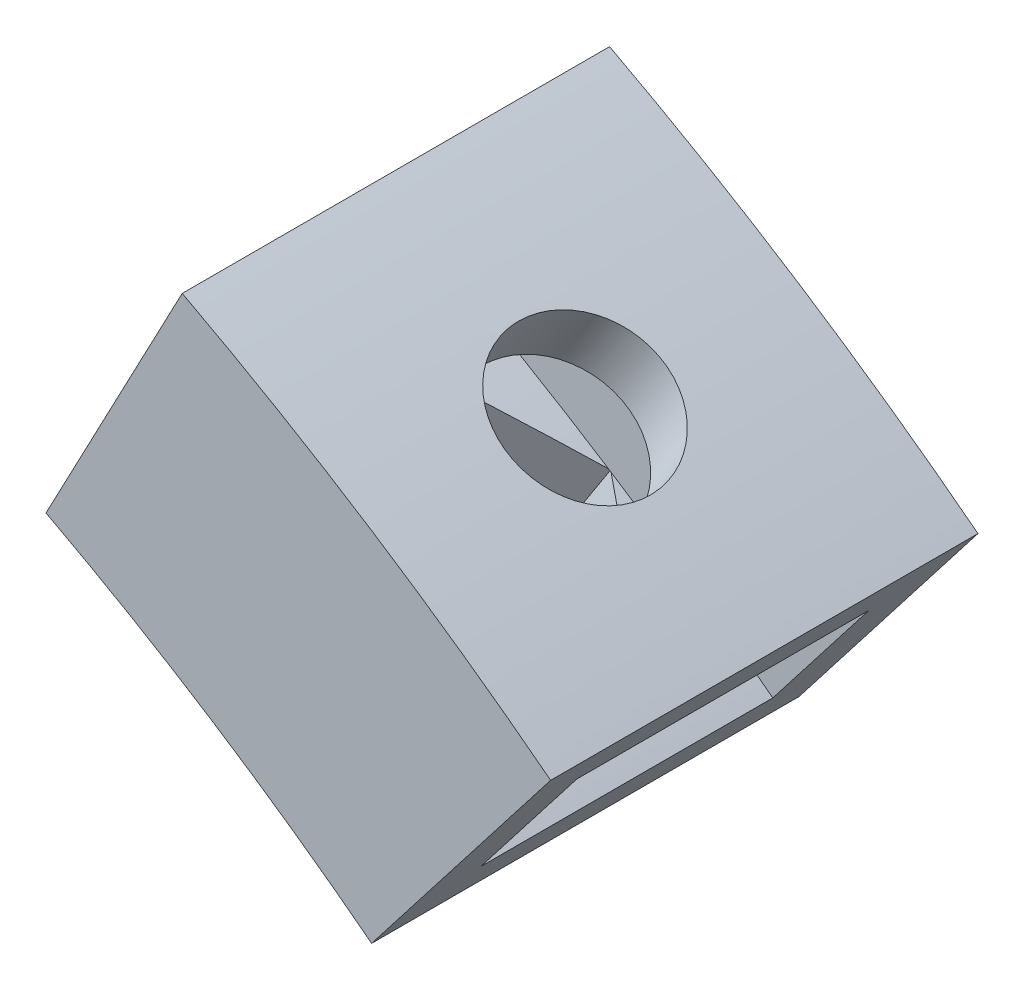
ISO-10303-21;
HEADER;
FILE_DESCRIPTION(('STEP AP214'),'2;1');
FILE_NAME('part.step','',(''),(''),'','','');
FILE_SCHEMA(('AUTOMOTIVE_DESIGN { 1 0 10303 214 1 1 1 1 }'));
ENDSEC;
DATA;
#1=APPLICATION_CONTEXT('core data for automotive mechanical design processes');
#2=APPLICATION_PROTOCOL_DEFINITION('international standard','automotive_design',2000,#1);
#3=PRODUCT_CONTEXT('',#1,'mechanical');
#4=PRODUCT('Part','Part','',(#3));
#5=PRODUCT_RELATED_PRODUCT_CATEGORY('part','',(#4));
#6=PRODUCT_DEFINITION_FORMATION('','',#4);
#7=PRODUCT_DEFINITION_CONTEXT('part definition',#1,'design');
#8=PRODUCT_DEFINITION('design','',#6,#7);
#9=PRODUCT_DEFINITION_SHAPE('','',#8);
#10=(LENGTH_UNIT() NAMED_UNIT(*) SI_UNIT(.MILLI.,.METRE.));
#11=(NAMED_UNIT(*) PLANE_ANGLE_UNIT() SI_UNIT($,.RADIAN.));
#12=(NAMED_UNIT(*) SI_UNIT($,.STERADIAN.) SOLID_ANGLE_UNIT());
#13=UNCERTAINTY_MEASURE_WITH_UNIT(LENGTH_MEASURE(1.E-05),#10,'distance_accuracy_value','');
#14=(GEOMETRIC_REPRESENTATION_CONTEXT(3) GLOBAL_UNCERTAINTY_ASSIGNED_CONTEXT((#13)) GLOBAL_UNIT_ASSIGNED_CONTEXT((#10,
#11,#12)) REPRESENTATION_CONTEXT('',''));
#15=CARTESIAN_POINT('',(0.,0.,0.));
#16=DIRECTION('',(0.,0.,1.));
#17=DIRECTION('',(1.,0.,0.));
#18=AXIS2_PLACEMENT_3D('',#15,#16,#17);
#19=CARTESIAN_POINT('',(2.00000000000008,25.,6.35));
#20=DIRECTION('',(0.,0.,1.));
#21=DIRECTION('',(1.,0.,0.));
#22=AXIS2_PLACEMENT_3D('',#19,#20,#21);
#23=CYLINDRICAL_SURFACE('',#22,107.45);
#24=CARTESIAN_POINT('',(2.00000000000008,25.,6.8924075135857));
#25=DIRECTION('',(-0.420243080128222,0.270916506703347,0.866025403784438));
#26=DIRECTION('',(0.727882366311319,-0.469241154219272,0.5));
#27=AXIS2_PLACEMENT_3D('',#24,#25,#26);
#28=ELLIPSE('',#27,124.072572848851,107.45);
#29=CARTESIAN_POINT('',(55.1131937531535,118.404984606497,3.44620375679288));
#30=VERTEX_POINT('',#29);
#31=CARTESIAN_POINT('',(60.1582151263532,115.350026070348,6.85));
#32=VERTEX_POINT('',#31);
#33=EDGE_CURVE('E207',#30,#32,#28,.F.);
#34=ORIENTED_EDGE('',*,*,#33,.F.);
#35=DIRECTION('',(0.,0.,1.));
#36=VECTOR('',#35,1.);
#37=CARTESIAN_POINT('',(55.1131937531535,118.404984606497,6.35));
#38=LINE('',#37,#36);
#39=CARTESIAN_POINT('',(55.1131937531534,118.404984606497,-3.44620375679288));
#40=VERTEX_POINT('',#39);
#41=EDGE_CURVE('E415',#40,#30,#38,.T.);
#42=ORIENTED_EDGE('',*,*,#41,.F.);
#43=CARTESIAN_POINT('',(2.00000000000008,25.,-6.89240751358571));
#44=DIRECTION('',(-0.420243080128222,0.270916506703348,-0.866025403784438));
#45=DIRECTION('',(-0.727882366311319,0.469241154219272,0.500000000000001));
#46=AXIS2_PLACEMENT_3D('',#43,#44,#45);
#47=ELLIPSE('',#46,124.072572848851,107.45);
#48=CARTESIAN_POINT('',(60.1582151263532,115.350026070348,-6.85));
#49=VERTEX_POINT('',#48);
#50=EDGE_CURVE('E187',#49,#40,#47,.F.);
#51=ORIENTED_EDGE('',*,*,#50,.F.);
#52=CARTESIAN_POINT('',(2.00000000000008,25.,-6.85));
#53=DIRECTION('',(0.,0.,1.));
#54=DIRECTION('',(1.,0.,0.));
#55=AXIS2_PLACEMENT_3D('',#52,#53,#54);
#56=CIRCLE('',#55,107.45);
#57=CARTESIAN_POINT('',(52.1273569123766,120.040783819259,-6.85));
#58=VERTEX_POINT('',#57);
#59=EDGE_CURVE('E290',#49,#58,#56,.T.);
#60=ORIENTED_EDGE('',*,*,#59,.T.);
#61=DIRECTION('',(0.,0.,-1.));
#62=VECTOR('',#61,1.);
#63=CARTESIAN_POINT('',(52.1273569123766,120.040783819259,6.85));
#64=LINE('',#63,#62);
#65=CARTESIAN_POINT('',(52.1273569123766,120.040783819259,6.85));
#66=VERTEX_POINT('',#65);
#67=EDGE_CURVE('E375',#66,#58,#64,.T.);
#68=ORIENTED_EDGE('',*,*,#67,.F.);
#69=CARTESIAN_POINT('',(2.00000000000008,25.,6.85));
#70=DIRECTION('',(0.,0.,1.));
#71=DIRECTION('',(1.,0.,0.));
#72=AXIS2_PLACEMENT_3D('',#69,#70,#71);
#73=CIRCLE('',#72,107.45);
#74=EDGE_CURVE('E298',#32,#66,#73,.T.);
#75=ORIENTED_EDGE('',*,*,#74,.F.);
#76=EDGE_LOOP('',(#34,#42,#51,#60,#68,#75));
#77=FACE_BOUND('',#76,.T.);
#78=ADVANCED_FACE('F43',(#77),#23,.T.);
#79=CARTESIAN_POINT('',(65.9231162623651,107.383923385016,-10.025));
#80=DIRECTION('',(0.,0.,1.));
#81=DIRECTION('',(1.,0.,0.));
#82=AXIS2_PLACEMENT_3D('',#79,#80,#81);
#83=PLANE('',#82);
#84=CARTESIAN_POINT('',(2.00000000000008,25.,-10.025));
#85=DIRECTION('',(0.,0.,1.));
#86=DIRECTION('',(1.,0.,0.));
#87=AXIS2_PLACEMENT_3D('',#84,#85,#86);
#88=CIRCLE('',#87,117.975);
#89=CARTESIAN_POINT('',(74.3215501419566,118.20780015677,-10.025));
#90=VERTEX_POINT('',#89);
#91=CARTESIAN_POINT('',(57.0374586480934,129.350269623798,-10.025));
#92=VERTEX_POINT('',#91);
#93=EDGE_CURVE('E322',#90,#92,#88,.T.);
#94=ORIENTED_EDGE('',*,*,#93,.F.);
#95=DIRECTION('',(0.6130243707731,0.790063997938296,0.));
#96=VECTOR('',#95,1.);
#97=CARTESIAN_POINT('',(65.9231162623651,107.383923385016,-10.025));
#98=LINE('',#97,#96);
#99=CARTESIAN_POINT('',(65.9231162623651,107.383923385016,-10.025));
#100=VERTEX_POINT('',#99);
#101=EDGE_CURVE('E332',#100,#90,#98,.T.);
#102=ORIENTED_EDGE('',*,*,#101,.F.);
#103=CARTESIAN_POINT('',(2.00000000000008,25.,-10.025));
#104=DIRECTION('',(0.,0.,1.));
#105=DIRECTION('',(1.,0.,0.));
#106=AXIS2_PLACEMENT_3D('',#103,#104,#105);
#107=CIRCLE('',#106,104.275);
#108=CARTESIAN_POINT('',(50.6461623270179,117.232459122878,-10.025));
#109=VERTEX_POINT('',#108);
#110=EDGE_CURVE('E69',#100,#109,#107,.T.);
#111=ORIENTED_EDGE('',*,*,#110,.T.);
#112=DIRECTION('',(0.466517979640545,0.884511715395621,0.));
#113=VECTOR('',#112,1.);
#114=CARTESIAN_POINT('',(50.6461623270179,117.232459122878,-10.025));
#115=LINE('',#114,#113);
#116=EDGE_CURVE('E329',#109,#92,#115,.T.);
#117=ORIENTED_EDGE('',*,*,#116,.T.);
#118=EDGE_LOOP('',(#94,#102,#111,#117));
#119=FACE_BOUND('',#118,.T.);
#120=ADVANCED_FACE('F261',(#119),#83,.F.);
#121=CARTESIAN_POINT('',(2.00000000000008,25.,6.35));
#122=DIRECTION('',(0.,0.,1.));
#123=DIRECTION('',(1.,0.,0.));
#124=AXIS2_PLACEMENT_3D('',#121,#122,#123);
#125=CYLINDRICAL_SURFACE('',#124,117.975);
#126=CARTESIAN_POINT('',(62.8029414199607,126.099470521268,0.));
#127=CARTESIAN_POINT('',(62.8029495165777,126.099466220601,-0.206372626392673));
#128=CARTESIAN_POINT('',(62.8178977873018,126.090480174403,-0.412893617834125));
#129=CARTESIAN_POINT('',(62.8772958156336,126.054720991092,-0.8202442186931));
#130=CARTESIAN_POINT('',(62.921780791923,126.027926619828,-1.02106673498274));
#131=CARTESIAN_POINT('',(63.0389090161015,125.957203133765,-1.4110601853181));
#132=CARTESIAN_POINT('',(63.1115384632237,125.91328241688,-1.60023677738864));
#133=CARTESIAN_POINT('',(63.282762764463,125.809392379523,-1.96160960106666));
#134=CARTESIAN_POINT('',(63.3813512893251,125.749426970957,-2.13380995771587));
#135=CARTESIAN_POINT('',(63.6016126375272,125.614902252788,-2.45647785291352));
#136=CARTESIAN_POINT('',(63.7232948580627,125.540337001882,-2.6069365003585));
#137=CARTESIAN_POINT('',(63.9861235302592,125.378508062639,-2.8817751217911));
#138=CARTESIAN_POINT('',(64.1272707575135,125.291243868298,-3.00615405612077));
#139=CARTESIAN_POINT('',(64.4249086000639,125.106253913639,-3.2253174131053));
#140=CARTESIAN_POINT('',(64.5814020444935,125.008526224029,-3.32009636536239));
#141=CARTESIAN_POINT('',(64.9051478286196,124.805207790806,-3.47733377303638));
#142=CARTESIAN_POINT('',(65.0724001235013,124.699617079945,-3.53979236307031));
#143=CARTESIAN_POINT('',(65.4127724237043,124.483473632401,-3.63059658463169));
#144=CARTESIAN_POINT('',(65.5858904926997,124.37292252934,-3.65895336271014));
#145=CARTESIAN_POINT('',(65.9330881558451,124.149903826806,-3.68078335865567));
#146=CARTESIAN_POINT('',(66.1071677459921,124.037436235308,-3.67425672163718));
#147=CARTESIAN_POINT('',(66.4512930378886,123.81383280504,-3.62651455667658));
#148=CARTESIAN_POINT('',(66.6213401177839,123.702696517903,-3.58531106077814));
#149=CARTESIAN_POINT('',(66.9526961438451,123.484959350499,-3.46940340935781));
#150=CARTESIAN_POINT('',(67.1140050700372,123.378358480598,-3.3946991772632));
#151=CARTESIAN_POINT('',(67.4234382270066,123.172852142706,-3.21389683984375));
#152=CARTESIAN_POINT('',(67.5715601368659,123.073948029729,-3.10779322237277));
#153=CARTESIAN_POINT('',(67.8505209774469,122.886862071692,-2.8672081078721));
#154=CARTESIAN_POINT('',(67.9813598650361,122.798680253391,-2.73272654002294));
#155=CARTESIAN_POINT('',(68.2222459223635,122.635731038115,-2.43913486189143));
#156=CARTESIAN_POINT('',(68.3322842338592,122.560969356991,-2.28001431096266));
#157=CARTESIAN_POINT('',(68.5285249622798,122.427255620289,-1.94169834637941));
#158=CARTESIAN_POINT('',(68.6147273752004,122.368303567368,-1.76250292935245));
#159=CARTESIAN_POINT('',(68.7609783006208,122.268084694122,-1.38911801062646));
#160=CARTESIAN_POINT('',(68.8210265280352,122.226818066573,-1.19492834551445));
#161=CARTESIAN_POINT('',(68.9133571759096,122.163297719665,-0.797069987249016));
#162=CARTESIAN_POINT('',(68.9456396779101,122.141043944472,-0.593401321934711));
#163=CARTESIAN_POINT('',(68.9815673016802,122.116274400647,-0.182458120883018));
#164=CARTESIAN_POINT('',(68.9852244553971,122.113750339127,0.0248148631490834));
#165=CARTESIAN_POINT('',(68.9638353190534,122.128500177096,0.437163506354018));
#166=CARTESIAN_POINT('',(68.9387890649607,122.145774051777,0.642239168279964));
#167=CARTESIAN_POINT('',(68.8606707292865,122.19955534612,1.04433102243375));
#168=CARTESIAN_POINT('',(68.8076041244301,122.236059007215,1.2413487815159));
#169=CARTESIAN_POINT('',(68.6748689408076,122.32712323558,1.62178030440115));
#170=CARTESIAN_POINT('',(68.5952003040792,122.381683842194,1.8051940385618));
#171=CARTESIAN_POINT('',(68.4113685829763,122.507143782334,2.15327831960398));
#172=CARTESIAN_POINT('',(68.3071973149612,122.578048574501,2.31794257701402));
#173=CARTESIAN_POINT('',(68.0771852130066,122.733952497434,2.62379049924137));
#174=CARTESIAN_POINT('',(67.9513443201075,122.81895166655,2.76497410016949));
#175=CARTESIAN_POINT('',(67.6813644755462,123.000435716536,3.01990176385725));
#176=CARTESIAN_POINT('',(67.5372192679838,123.096924523537,3.13363640660482));
#177=CARTESIAN_POINT('',(67.234616675129,123.298415095514,3.33037322583278));
#178=CARTESIAN_POINT('',(67.0761593234088,123.403416840523,3.41337547440015));
#179=CARTESIAN_POINT('',(66.74935061902,123.618763302225,3.5462748590417));
#180=CARTESIAN_POINT('',(66.5810010956068,123.729107030422,3.59617809492772));
#181=CARTESIAN_POINT('',(66.2390928498153,123.951913545389,3.6614828885046));
#182=CARTESIAN_POINT('',(66.0655341330894,124.064376329861,3.67688448363088));
#183=CARTESIAN_POINT('',(65.7181912414749,124.288143264432,3.67274810044119));
#184=CARTESIAN_POINT('',(65.5444071936622,124.399447886373,3.65322495996852));
#185=CARTESIAN_POINT('',(65.2015011708493,124.617830792783,3.57982382024783));
#186=CARTESIAN_POINT('',(65.0323792050633,124.724909068899,3.52594575310522));
#187=CARTESIAN_POINT('',(64.7036683028243,124.931918655813,3.38536629617609));
#188=CARTESIAN_POINT('',(64.544079523212,125.031849849033,3.29866436654115));
#189=CARTESIAN_POINT('',(64.2390807130739,125.221902728704,3.09490317954418));
#190=CARTESIAN_POINT('',(64.0936701734583,125.312024767381,2.97784501271845));
#191=CARTESIAN_POINT('',(63.821235873021,125.480152768315,2.71664951455218));
#192=CARTESIAN_POINT('',(63.6942179778653,125.558154865933,2.57250357807923));
#193=CARTESIAN_POINT('',(63.4623443292489,125.700046608506,2.26119757377545));
#194=CARTESIAN_POINT('',(63.3574940697148,125.763932755203,2.09403181772834));
#195=CARTESIAN_POINT('',(63.1730549757024,125.876011330005,1.74136308475961));
#196=CARTESIAN_POINT('',(63.0934829095249,125.924193341313,1.55584804236542));
#197=CARTESIAN_POINT('',(62.9621498437435,126.003578432197,1.1719744889172));
#198=CARTESIAN_POINT('',(62.9103556941987,126.034801750709,0.97363160484585));
#199=CARTESIAN_POINT('',(62.849854004998,126.071245066963,0.645030597501));
#200=CARTESIAN_POINT('',(62.832284999726,126.081817936066,0.516905171198313));
#201=CARTESIAN_POINT('',(62.8088261661371,126.095932012823,0.259206009667065));
#202=CARTESIAN_POINT('',(62.8029363340979,126.099473222718,0.129632274900126));
#203=CARTESIAN_POINT('',(62.8029414199607,126.099470521268,0.));
#204=B_SPLINE_CURVE_WITH_KNOTS('',3,(#126,#127,#128,#129,#130,#131,#132,#133,#134,#135,#136,
#137,#138,#139,#140,#141,#142,#143,#144,#145,#146,#147,#148,#149,#150,#151,#152,#153,#154,#155,
#156,#157,#158,#159,#160,#161,#162,#163,#164,#165,#166,#167,#168,#169,#170,#171,#172,#173,#174,
#175,#176,#177,#178,#179,#180,#181,#182,#183,#184,#185,#186,#187,#188,#189,#190,#191,#192,#193,
#194,#195,#196,#197,#198,#199,#200,#201,#202,#203),.UNSPECIFIED.,.T.,.F.,(4,2,2,2,2,2,2,2,2,2,2,
2,2,2,2,2,2,2,2,2,2,2,2,2,2,2,2,2,2,2,2,2,2,2,2,2,2,2,4),(0.,0.618644702899641,1.23802838706505,
1.85710873722485,2.47603828484282,3.09522022692702,3.71442684777563,4.33374783709818,
4.95306624687601,5.57218217057634,6.19129551876682,6.8101941379024,7.42909417166343,
8.04810291752728,8.66711320819612,9.28638652285301,9.90565994154492,10.5249401102657,
11.1442184603222,11.7632364982658,12.3822537605264,13.0011500773685,13.6200477427139,
14.2391524081081,14.8582587580145,15.4775772734475,16.0968943361764,16.7160972333258,
17.3352994586195,17.9542386770922,18.573179118759,19.1921297404747,19.8110581297039,
20.430183470989,21.0494620740938,21.6691506222592,22.288097984189,22.6766977086489,
23.0652973092529),.UNSPECIFIED.);
#205=CARTESIAN_POINT('',(62.8029414199607,126.099470521268,0.));
#206=VERTEX_POINT('',#205);
#207=EDGE_CURVE('E221',#206,#206,#204,.T.);
#208=ORIENTED_EDGE('',*,*,#207,.T.);
#209=EDGE_LOOP('',(#208));
#210=FACE_BOUND('',#209,.T.);
#211=CARTESIAN_POINT('',(2.00000000000008,25.,10.025));
#212=DIRECTION('',(0.,0.,1.));
#213=DIRECTION('',(1.,0.,0.));
#214=AXIS2_PLACEMENT_3D('',#211,#212,#213);
#215=CIRCLE('',#214,117.975);
#216=CARTESIAN_POINT('',(74.3215501419566,118.20780015677,10.025));
#217=VERTEX_POINT('',#216);
#218=CARTESIAN_POINT('',(57.0374586480934,129.350269623798,10.025));
#219=VERTEX_POINT('',#218);
#220=EDGE_CURVE('E324',#217,#219,#215,.T.);
#221=ORIENTED_EDGE('',*,*,#220,.F.);
#222=DIRECTION('',(0.,0.,1.));
#223=VECTOR('',#222,1.);
#224=CARTESIAN_POINT('',(74.3215501419566,118.20780015677,-10.025));
#225=LINE('',#224,#223);
#226=EDGE_CURVE('E358',#90,#217,#225,.T.);
#227=ORIENTED_EDGE('',*,*,#226,.F.);
#228=ORIENTED_EDGE('',*,*,#93,.T.);
#229=DIRECTION('',(0.,0.,1.));
#230=VECTOR('',#229,1.);
#231=CARTESIAN_POINT('',(57.0374586480934,129.350269623798,-10.025));
#232=LINE('',#231,#230);
#233=EDGE_CURVE('E339',#92,#219,#232,.T.);
#234=ORIENTED_EDGE('',*,*,#233,.T.);
#235=EDGE_LOOP('',(#221,#227,#228,#234));
#236=FACE_BOUND('',#235,.T.);
#237=ADVANCED_FACE('F45',(#210,#236),#125,.T.);
#238=CARTESIAN_POINT('',(74.3215501419566,118.20780015677,10.025));
#239=DIRECTION('',(0.,0.,-1.));
#240=DIRECTION('',(-1.,0.,0.));
#241=AXIS2_PLACEMENT_3D('',#238,#239,#240);
#242=PLANE('',#241);
#243=CARTESIAN_POINT('',(2.00000000000008,25.,10.025));
#244=DIRECTION('',(0.,0.,1.));
#245=DIRECTION('',(1.,0.,0.));
#246=AXIS2_PLACEMENT_3D('',#243,#244,#245);
#247=CIRCLE('',#246,104.275);
#248=CARTESIAN_POINT('',(65.9231162623651,107.383923385016,10.025));
#249=VERTEX_POINT('',#248);
#250=CARTESIAN_POINT('',(50.6461623270179,117.232459122878,10.025));
#251=VERTEX_POINT('',#250);
#252=EDGE_CURVE('E326',#249,#251,#247,.T.);
#253=ORIENTED_EDGE('',*,*,#252,.F.);
#254=DIRECTION('',(-0.6130243707731,-0.790063997938296,0.));
#255=VECTOR('',#254,1.);
#256=CARTESIAN_POINT('',(74.3215501419566,118.20780015677,10.025));
#257=LINE('',#256,#255);
#258=EDGE_CURVE('E361',#217,#249,#257,.T.);
#259=ORIENTED_EDGE('',*,*,#258,.F.);
#260=ORIENTED_EDGE('',*,*,#220,.T.);
#261=DIRECTION('',(-0.466517979640545,-0.884511715395621,0.));
#262=VECTOR('',#261,1.);
#263=CARTESIAN_POINT('',(57.0374586480934,129.350269623798,10.025));
#264=LINE('',#263,#262);
#265=EDGE_CURVE('E344',#219,#251,#264,.T.);
#266=ORIENTED_EDGE('',*,*,#265,.T.);
#267=EDGE_LOOP('',(#253,#259,#260,#266));
#268=FACE_BOUND('',#267,.T.);
#269=ADVANCED_FACE('F387',(#268),#242,.F.);
#270=CARTESIAN_POINT('',(2.00000000000008,25.,6.35));
#271=DIRECTION('',(0.,0.,1.));
#272=DIRECTION('',(1.,0.,0.));
#273=AXIS2_PLACEMENT_3D('',#270,#271,#272);
#274=CYLINDRICAL_SURFACE('',#273,114.8);
#275=CARTESIAN_POINT('',(61.0817632076541,123.429595428787,0.));
#276=CARTESIAN_POINT('',(61.0817713148924,123.429591146562,-0.206369612489661));
#277=CARTESIAN_POINT('',(61.0967273531652,123.420618085308,-0.412887516359059));
#278=CARTESIAN_POINT('',(61.1561554845957,123.38490953232,-0.82023182033175));
#279=CARTESIAN_POINT('',(61.2006627975054,123.358152845696,-1.02105113059003));
#280=CARTESIAN_POINT('',(61.3178473840906,123.287525327917,-1.41103815244768));
#281=CARTESIAN_POINT('',(61.390510831568,123.243662896549,-1.60021153007944));
#282=CARTESIAN_POINT('',(61.5618106949293,123.139903634579,-1.96157856209948));
#283=CARTESIAN_POINT('',(61.6604407868485,123.080010708014,-2.13377633674206));
#284=CARTESIAN_POINT('',(61.8807898515283,122.945636025833,-2.45644297432695));
#285=CARTESIAN_POINT('',(62.0025186145337,122.871148083761,-2.60690257586155));
#286=CARTESIAN_POINT('',(62.2654386236877,122.709470745875,-2.8817437973276));
#287=CARTESIAN_POINT('',(62.4066306460128,122.622280843512,-3.00612437675323));
#288=CARTESIAN_POINT('',(62.7043531134555,122.437426971292,-3.2252930184621));
#289=CARTESIAN_POINT('',(62.8608865612583,122.339760950654,-3.32007527238429));
#290=CARTESIAN_POINT('',(63.1847016081739,122.136547139525,-3.47731903162065));
#291=CARTESIAN_POINT('',(63.3519831612168,122.030999382817,-3.5397806754607));
#292=CARTESIAN_POINT('',(63.6923967540001,121.814920283551,-3.63058955199574));
#293=CARTESIAN_POINT('',(63.8655267531577,121.704390674803,-3.65894855960196));
#294=CARTESIAN_POINT('',(64.2127323662039,121.481389376185,-3.68078343903503));
#295=CARTESIAN_POINT('',(64.3868079760307,121.368917694654,-3.67425946058336));
#296=CARTESIAN_POINT('',(64.730906205102,121.145283334998,-3.62652347947247));
#297=CARTESIAN_POINT('',(64.9009302856056,121.034120192474,-3.58532418396026));
#298=CARTESIAN_POINT('',(65.2322270956651,120.816307508474,-3.46942672764405));
#299=CARTESIAN_POINT('',(65.3934998046173,120.709657977624,-3.39472848797643));
#300=CARTESIAN_POINT('',(65.702852907937,120.50403694819,-3.21393898649646));
#301=CARTESIAN_POINT('',(65.8509308497502,120.405066877452,-3.10784190424996));
#302=CARTESIAN_POINT('',(66.1297996238151,120.217840002793,-2.86727074818832));
#303=CARTESIAN_POINT('',(66.2605904101135,120.129583227349,-2.73279659894273));
#304=CARTESIAN_POINT('',(66.5013847956901,119.966481279917,-2.43921661812039));
#305=CARTESIAN_POINT('',(66.6113790407794,119.8916421439,-2.28009976062452));
#306=CARTESIAN_POINT('',(66.8075377291119,119.757781747003,-1.94178999395058));
#307=CARTESIAN_POINT('',(66.8937021682884,119.698760488822,-1.76259708134648));
#308=CARTESIAN_POINT('',(67.0398878781649,119.598419040195,-1.38921555810248));
#309=CARTESIAN_POINT('',(67.0999088462696,119.55709905463,-1.1950267739249));
#310=CARTESIAN_POINT('',(67.1921988959453,119.493493803875,-0.797168692618809));
#311=CARTESIAN_POINT('',(67.2244680635265,119.471208479691,-0.593499424874931));
#312=CARTESIAN_POINT('',(67.2603842718308,119.446401369181,-0.182558688062844));
#313=CARTESIAN_POINT('',(67.2640440119983,119.443870813908,0.0247111417974002));
#314=CARTESIAN_POINT('',(67.2426771552142,119.458632425858,0.43705441883552));
#315=CARTESIAN_POINT('',(67.2176505963004,119.475924566796,0.642127868925422));
#316=CARTESIAN_POINT('',(67.1395875608672,119.529764395323,1.04421401308583));
#317=CARTESIAN_POINT('',(67.0865568665738,119.566308107891,1.24122836213529));
#318=CARTESIAN_POINT('',(66.9539062771426,119.657469323547,1.62165459223373));
#319=CARTESIAN_POINT('',(66.874286320639,119.712086868348,1.80506644188819));
#320=CARTESIAN_POINT('',(66.6905582396594,119.837671912913,2.15315230765614));
#321=CARTESIAN_POINT('',(66.586441475789,119.908645180738,2.31781968260428));
#322=CARTESIAN_POINT('',(66.3565397874256,120.064688692701,2.62367557053611));
#323=CARTESIAN_POINT('',(66.2307548011558,120.149758977029,2.76486401657823));
#324=CARTESIAN_POINT('',(65.9608795781715,120.331381493947,3.01980571401056));
#325=CARTESIAN_POINT('',(65.8167827324914,120.427937871195,3.13354901694813));
#326=CARTESIAN_POINT('',(65.5142662090798,120.629550795055,3.3303036474786));
#327=CARTESIAN_POINT('',(65.3558465659763,120.734607321116,3.41331504936854));
#328=CARTESIAN_POINT('',(65.029100156648,120.950043190951,3.54623204350115));
#329=CARTESIAN_POINT('',(64.8607753242786,121.060421494962,3.59614407475835));
#330=CARTESIAN_POINT('',(64.5188993681735,121.283273941142,3.66146662260287));
#331=CARTESIAN_POINT('',(64.3453482509553,121.395748080696,3.67687718221422));
#332=CARTESIAN_POINT('',(63.998007022693,121.619510381681,3.67275860293397));
#333=CARTESIAN_POINT('',(63.8242170537343,121.730799052361,3.65324513019971));
#334=CARTESIAN_POINT('',(63.4812825038344,121.949127059924,3.57986463942644));
#335=CARTESIAN_POINT('',(63.3121379320629,122.056166388419,3.52599755358132));
#336=CARTESIAN_POINT('',(62.9833677256828,122.26307943123,3.38544125415038));
#337=CARTESIAN_POINT('',(62.8237422457311,122.36295302913,3.29875150746222));
#338=CARTESIAN_POINT('',(62.5186596718842,122.552878798056,3.09501559788964));
#339=CARTESIAN_POINT('',(62.3732020719157,122.642931319902,2.97797051983793));
#340=CARTESIAN_POINT('',(62.100664739819,122.810918515464,2.71679845805543));
#341=CARTESIAN_POINT('',(61.9735913079302,122.888849035663,2.57266222893233));
#342=CARTESIAN_POINT('',(61.7416072445642,123.030601850585,2.26137419950968));
#343=CARTESIAN_POINT('',(61.6367021059531,123.094420648882,2.09421671190313));
#344=CARTESIAN_POINT('',(61.4521583475188,123.206377403372,1.74156062400819));
#345=CARTESIAN_POINT('',(61.37253676483,123.254504786605,1.55604976637649));
#346=CARTESIAN_POINT('',(61.2411162637578,123.333799329966,1.17218187959773));
#347=CARTESIAN_POINT('',(61.1892841922943,123.364986700232,0.973840475532382));
#348=CARTESIAN_POINT('',(61.1287270144703,123.401393939896,0.64520646886061));
#349=CARTESIAN_POINT('',(61.1111388668138,123.411957874194,0.517046632963276));
#350=CARTESIAN_POINT('',(61.087654418371,123.426059962777,0.259277379383478));
#351=CARTESIAN_POINT('',(61.0817581136432,123.429598119432,0.129667962189696));
#352=CARTESIAN_POINT('',(61.0817632076541,123.429595428787,0.));
#353=B_SPLINE_CURVE_WITH_KNOTS('',3,(#275,#276,#277,#278,#279,#280,#281,#282,#283,#284,#285,
#286,#287,#288,#289,#290,#291,#292,#293,#294,#295,#296,#297,#298,#299,#300,#301,#302,#303,#304,
#305,#306,#307,#308,#309,#310,#311,#312,#313,#314,#315,#316,#317,#318,#319,#320,#321,#322,#323,
#324,#325,#326,#327,#328,#329,#330,#331,#332,#333,#334,#335,#336,#337,#338,#339,#340,#341,#342,
#343,#344,#345,#346,#347,#348,#349,#350,#351,#352),.UNSPECIFIED.,.T.,.F.,(4,2,2,2,2,2,2,2,2,2,2,
2,2,2,2,2,2,2,2,2,2,2,2,2,2,2,2,2,2,2,2,2,2,2,2,2,2,2,4),(0.,0.618635529844244,1.23800968752063,
1.8570800833533,2.47599984888427,3.09518252847786,3.71438990764146,4.33371872351119,
4.95304488492066,5.57215714479153,6.19126674736903,6.81014956923569,7.42903384809147,
8.04803292206738,8.66703364145529,9.28631212558756,9.90559071540141,10.5248764728065,
11.1441603108716,11.7631692392912,12.3821773469086,13.0010576931749,13.619939467771,
14.2390398340953,14.8581419655274,15.4774681761908,16.0967928895694,16.7159970867117,
17.3352005116932,17.9541262451702,18.5730532002676,19.1919902083454,19.8109051000247,
20.4300315934522,21.0493113148147,21.6690074519863,22.2879626329486,22.6766692577628,
23.0653757515402),.UNSPECIFIED.);
#354=CARTESIAN_POINT('',(61.0817632076541,123.429595428787,0.));
#355=VERTEX_POINT('',#354);
#356=EDGE_CURVE('E218',#355,#355,#353,.T.);
#357=ORIENTED_EDGE('',*,*,#356,.F.);
#358=EDGE_LOOP('',(#357));
#359=FACE_BOUND('',#358,.T.);
#360=CARTESIAN_POINT('',(2.00000000000008,25.,-6.85));
#361=DIRECTION('',(0.,0.,1.));
#362=DIRECTION('',(1.,0.,0.));
#363=AXIS2_PLACEMENT_3D('',#360,#361,#362);
#364=CIRCLE('',#363,114.8);
#365=CARTESIAN_POINT('',(72.375197764752,115.699346963316,-6.85));
#366=VERTEX_POINT('',#365);
#367=CARTESIAN_POINT('',(55.5562640627346,126.541944927417,-6.85));
#368=VERTEX_POINT('',#367);
#369=EDGE_CURVE('E289',#366,#368,#364,.T.);
#370=ORIENTED_EDGE('',*,*,#369,.F.);
#371=DIRECTION('',(0.,0.,1.));
#372=VECTOR('',#371,1.);
#373=CARTESIAN_POINT('',(72.375197764752,115.699346963316,-6.85));
#374=LINE('',#373,#372);
#375=CARTESIAN_POINT('',(72.375197764752,115.699346963316,6.85));
#376=VERTEX_POINT('',#375);
#377=EDGE_CURVE('E343',#366,#376,#374,.T.);
#378=ORIENTED_EDGE('',*,*,#377,.T.);
#379=CARTESIAN_POINT('',(2.00000000000008,25.,6.85));
#380=DIRECTION('',(0.,0.,1.));
#381=DIRECTION('',(1.,0.,0.));
#382=AXIS2_PLACEMENT_3D('',#379,#380,#381);
#383=CIRCLE('',#382,114.8);
#384=CARTESIAN_POINT('',(55.5562640627346,126.541944927417,6.85));
#385=VERTEX_POINT('',#384);
#386=EDGE_CURVE('E365',#376,#385,#383,.T.);
#387=ORIENTED_EDGE('',*,*,#386,.T.);
#388=DIRECTION('',(0.,0.,1.));
#389=VECTOR('',#388,1.);
#390=CARTESIAN_POINT('',(55.5562640627346,126.541944927417,-6.85));
#391=LINE('',#390,#389);
#392=EDGE_CURVE('E381',#368,#385,#391,.T.);
#393=ORIENTED_EDGE('',*,*,#392,.F.);
#394=EDGE_LOOP('',(#370,#378,#387,#393));
#395=FACE_BOUND('',#394,.T.);
#396=ADVANCED_FACE('F233',(#359,#395),#274,.F.);
#397=CARTESIAN_POINT('',(67.8694686395697,109.89237657847,-6.85));
#398=DIRECTION('',(0.,0.,1.));
#399=DIRECTION('',(1.,0.,0.));
#400=AXIS2_PLACEMENT_3D('',#397,#398,#399);
#401=PLANE('',#400);
#402=DIRECTION('',(-0.840486160256444,0.541833013406695,0.));
#403=VECTOR('',#402,1.);
#404=CARTESIAN_POINT('',(70.1922020428434,108.881468856997,-6.85));
#405=LINE('',#404,#403);
#406=CARTESIAN_POINT('',(60.2816858517059,115.270428667857,-6.85));
#407=VERTEX_POINT('',#406);
#408=EDGE_CURVE('E180',#407,#49,#405,.T.);
#409=ORIENTED_EDGE('',*,*,#408,.F.);
#410=CARTESIAN_POINT('',(67.8694686395697,109.89237657847,-6.85));
#411=VERTEX_POINT('',#410);
#412=EDGE_CURVE('E284',#411,#407,#56,.T.);
#413=ORIENTED_EDGE('',*,*,#412,.F.);
#414=DIRECTION('',(0.6130243707731,0.790063997938296,0.));
#415=VECTOR('',#414,1.);
#416=CARTESIAN_POINT('',(67.8694686395697,109.89237657847,-6.85));
#417=LINE('',#416,#415);
#418=EDGE_CURVE('E347',#411,#366,#417,.T.);
#419=ORIENTED_EDGE('',*,*,#418,.T.);
#420=ORIENTED_EDGE('',*,*,#369,.T.);
#421=DIRECTION('',(0.466517979640545,0.884511715395621,0.));
#422=VECTOR('',#421,1.);
#423=CARTESIAN_POINT('',(52.1273569123766,120.040783819259,-6.85));
#424=LINE('',#423,#422);
#425=EDGE_CURVE('E379',#58,#368,#424,.T.);
#426=ORIENTED_EDGE('',*,*,#425,.F.);
#427=ORIENTED_EDGE('',*,*,#59,.F.);
#428=EDGE_LOOP('',(#409,#413,#419,#420,#426,#427));
#429=FACE_BOUND('',#428,.T.);
#430=ADVANCED_FACE('F273',(#429),#401,.T.);
#431=CARTESIAN_POINT('',(2.00000000000008,25.,-6.89240751358581));
#432=DIRECTION('',(0.420243080128222,-0.270916506703347,-0.866025403784439));
#433=DIRECTION('',(0.727882366311319,-0.469241154219272,0.5));
#434=AXIS2_PLACEMENT_3D('',#431,#432,#433);
#435=ELLIPSE('',#434,124.072572848851,107.45);
#436=CARTESIAN_POINT('',(65.1469175342949,111.936582092448,-3.44620375679288));
#437=VERTEX_POINT('',#436);
#438=EDGE_CURVE('E175',#437,#407,#435,.F.);
#439=ORIENTED_EDGE('',*,*,#438,.F.);
#440=DIRECTION('',(0.,0.,1.));
#441=VECTOR('',#440,1.);
#442=CARTESIAN_POINT('',(65.1469175342949,111.936582092448,6.35));
#443=LINE('',#442,#441);
#444=CARTESIAN_POINT('',(65.1469175342949,111.936582092448,3.44620375679288));
#445=VERTEX_POINT('',#444);
#446=EDGE_CURVE('E206',#445,#437,#443,.F.);
#447=ORIENTED_EDGE('',*,*,#446,.F.);
#448=CARTESIAN_POINT('',(2.00000000000008,25.,6.8924075135858));
#449=DIRECTION('',(0.420243080128222,-0.270916506703347,0.866025403784438));
#450=DIRECTION('',(-0.727882366311319,0.469241154219272,0.5));
#451=AXIS2_PLACEMENT_3D('',#448,#449,#450);
#452=ELLIPSE('',#451,124.072572848851,107.45);
#453=CARTESIAN_POINT('',(60.2816858517059,115.270428667857,6.85));
#454=VERTEX_POINT('',#453);
#455=EDGE_CURVE('E203',#454,#445,#452,.F.);
#456=ORIENTED_EDGE('',*,*,#455,.F.);
#457=CARTESIAN_POINT('',(67.8694686395697,109.89237657847,6.85));
#458=VERTEX_POINT('',#457);
#459=EDGE_CURVE('E293',#458,#454,#73,.T.);
#460=ORIENTED_EDGE('',*,*,#459,.F.);
#461=DIRECTION('',(0.,0.,-1.));
#462=VECTOR('',#461,1.);
#463=CARTESIAN_POINT('',(67.8694686395697,109.89237657847,6.85));
#464=LINE('',#463,#462);
#465=EDGE_CURVE('E286',#458,#411,#464,.T.);
#466=ORIENTED_EDGE('',*,*,#465,.T.);
#467=ORIENTED_EDGE('',*,*,#412,.T.);
#468=EDGE_LOOP('',(#439,#447,#456,#460,#466,#467));
#469=FACE_BOUND('',#468,.T.);
#470=ADVANCED_FACE('F264',(#469),#23,.T.);
#471=CARTESIAN_POINT('',(72.375197764752,115.699346963316,6.85));
#472=DIRECTION('',(0.,0.,-1.));
#473=DIRECTION('',(-1.,0.,0.));
#474=AXIS2_PLACEMENT_3D('',#471,#472,#473);
#475=PLANE('',#474);
#476=ORIENTED_EDGE('',*,*,#459,.T.);
#477=DIRECTION('',(-0.840486160256444,0.541833013406695,0.));
#478=VECTOR('',#477,1.);
#479=CARTESIAN_POINT('',(70.1922020428434,108.881468856997,6.85));
#480=LINE('',#479,#478);
#481=EDGE_CURVE('E300',#32,#454,#480,.F.);
#482=ORIENTED_EDGE('',*,*,#481,.F.);
#483=ORIENTED_EDGE('',*,*,#74,.T.);
#484=DIRECTION('',(-0.466517979640545,-0.884511715395621,0.));
#485=VECTOR('',#484,1.);
#486=CARTESIAN_POINT('',(55.5562640627346,126.541944927417,6.85));
#487=LINE('',#486,#485);
#488=EDGE_CURVE('E340',#385,#66,#487,.T.);
#489=ORIENTED_EDGE('',*,*,#488,.F.);
#490=ORIENTED_EDGE('',*,*,#386,.F.);
#491=DIRECTION('',(-0.6130243707731,-0.790063997938296,0.));
#492=VECTOR('',#491,1.);
#493=CARTESIAN_POINT('',(72.375197764752,115.699346963316,6.85));
#494=LINE('',#493,#492);
#495=EDGE_CURVE('E354',#376,#458,#494,.T.);
#496=ORIENTED_EDGE('',*,*,#495,.T.);
#497=EDGE_LOOP('',(#476,#482,#483,#489,#490,#496));
#498=FACE_BOUND('',#497,.T.);
#499=ADVANCED_FACE('F255',(#498),#475,.T.);
#500=CARTESIAN_POINT('',(2.00000000000008,25.,6.35));
#501=DIRECTION('',(0.,0.,1.));
#502=DIRECTION('',(1.,0.,0.));
#503=AXIS2_PLACEMENT_3D('',#500,#501,#502);
#504=CYLINDRICAL_SURFACE('',#503,104.275);
#505=DIRECTION('',(0.,0.,1.));
#506=VECTOR('',#505,1.);
#507=CARTESIAN_POINT('',(63.4238559321574,109.263785503771,6.35));
#508=LINE('',#507,#506);
#509=CARTESIAN_POINT('',(63.4238559321574,109.263785503771,3.44620375679288));
#510=VERTEX_POINT('',#509);
#511=CARTESIAN_POINT('',(63.4238559321574,109.263785503771,-3.44620375679288));
#512=VERTEX_POINT('',#511);
#513=EDGE_CURVE('E53',#510,#512,#508,.F.);
#514=ORIENTED_EDGE('',*,*,#513,.T.);
#515=CARTESIAN_POINT('',(2.00000000000008,25.,-6.89240751358581));
#516=DIRECTION('',(0.420243080128222,-0.270916506703347,-0.866025403784439));
#517=DIRECTION('',(0.727882366311319,-0.469241154219272,0.5));
#518=AXIS2_PLACEMENT_3D('',#515,#516,#517);
#519=ELLIPSE('',#518,120.406398639496,104.275);
#520=CARTESIAN_POINT('',(58.4996374729832,112.641694360741,-6.89240751358576));
#521=VERTEX_POINT('',#520);
#522=EDGE_CURVE('E11',#512,#521,#519,.F.);
#523=ORIENTED_EDGE('',*,*,#522,.T.);
#524=CARTESIAN_POINT('',(2.00000000000008,25.,-6.89240751358571));
#525=DIRECTION('',(-0.420243080128222,0.270916506703348,-0.866025403784438));
#526=DIRECTION('',(-0.727882366311319,0.469241154219272,0.500000000000001));
#527=AXIS2_PLACEMENT_3D('',#524,#525,#526);
#528=ELLIPSE('',#527,120.406398639496,104.275);
#529=CARTESIAN_POINT('',(53.3901321510159,115.73218801782,-3.44620375679288));
#530=VERTEX_POINT('',#529);
#531=EDGE_CURVE('E166',#521,#530,#528,.F.);
#532=ORIENTED_EDGE('',*,*,#531,.T.);
#533=DIRECTION('',(0.,0.,1.));
#534=VECTOR('',#533,1.);
#535=CARTESIAN_POINT('',(53.3901321510159,115.73218801782,6.35));
#536=LINE('',#535,#534);
#537=CARTESIAN_POINT('',(53.3901321510159,115.73218801782,3.44620375679288));
#538=VERTEX_POINT('',#537);
#539=EDGE_CURVE('E318',#530,#538,#536,.T.);
#540=ORIENTED_EDGE('',*,*,#539,.T.);
#541=CARTESIAN_POINT('',(2.00000000000008,25.,6.8924075135857));
#542=DIRECTION('',(-0.420243080128222,0.270916506703347,0.866025403784438));
#543=DIRECTION('',(0.727882366311319,-0.469241154219272,0.5));
#544=AXIS2_PLACEMENT_3D('',#541,#542,#543);
#545=ELLIPSE('',#544,120.406398639496,104.275);
#546=CARTESIAN_POINT('',(58.4996374729832,112.641694360741,6.89240751358575));
#547=VERTEX_POINT('',#546);
#548=EDGE_CURVE('E315',#538,#547,#545,.F.);
#549=ORIENTED_EDGE('',*,*,#548,.T.);
#550=CARTESIAN_POINT('',(2.00000000000008,25.,6.8924075135858));
#551=DIRECTION('',(0.420243080128222,-0.270916506703347,0.866025403784438));
#552=DIRECTION('',(-0.727882366311319,0.469241154219272,0.5));
#553=AXIS2_PLACEMENT_3D('',#550,#551,#552);
#554=ELLIPSE('',#553,120.406398639496,104.275);
#555=EDGE_CURVE('E312',#547,#510,#554,.F.);
#556=ORIENTED_EDGE('',*,*,#555,.T.);
#557=EDGE_LOOP('',(#514,#523,#532,#540,#549,#556));
#558=FACE_BOUND('',#557,.T.);
#559=DIRECTION('',(0.,0.,-1.));
#560=VECTOR('',#559,1.);
#561=CARTESIAN_POINT('',(65.9231162623651,107.383923385016,10.025));
#562=LINE('',#561,#560);
#563=EDGE_CURVE('E364',#249,#100,#562,.T.);
#564=ORIENTED_EDGE('',*,*,#563,.F.);
#565=ORIENTED_EDGE('',*,*,#252,.T.);
#566=DIRECTION('',(0.,0.,-1.));
#567=VECTOR('',#566,1.);
#568=CARTESIAN_POINT('',(50.6461623270179,117.232459122878,10.025));
#569=LINE('',#568,#567);
#570=EDGE_CURVE('E337',#251,#109,#569,.T.);
#571=ORIENTED_EDGE('',*,*,#570,.T.);
#572=ORIENTED_EDGE('',*,*,#110,.F.);
#573=EDGE_LOOP('',(#564,#565,#571,#572));
#574=FACE_BOUND('',#573,.T.);
#575=ADVANCED_FACE('F250',(#558,#574),#504,.F.);
#576=CARTESIAN_POINT('',(-11.545276172583,7.54288808682552,0.));
#577=DIRECTION('',(0.790063997938297,-0.613024370773101,0.));
#578=DIRECTION('',(0.6130243707731,0.790063997938296,0.));
#579=AXIS2_PLACEMENT_3D('',#576,#577,#578);
#580=PLANE('',#579);
#581=ORIENTED_EDGE('',*,*,#377,.F.);
#582=ORIENTED_EDGE('',*,*,#418,.F.);
#583=ORIENTED_EDGE('',*,*,#465,.F.);
#584=ORIENTED_EDGE('',*,*,#495,.F.);
#585=EDGE_LOOP('',(#581,#582,#583,#584));
#586=FACE_BOUND('',#585,.T.);
#587=ORIENTED_EDGE('',*,*,#101,.T.);
#588=ORIENTED_EDGE('',*,*,#226,.T.);
#589=ORIENTED_EDGE('',*,*,#258,.T.);
#590=ORIENTED_EDGE('',*,*,#563,.T.);
#591=EDGE_LOOP('',(#587,#588,#589,#590));
#592=FACE_BOUND('',#591,.T.);
#593=ADVANCED_FACE('F247',(#586,#592),#580,.T.);
#594=CARTESIAN_POINT('',(-8.3080973204009,5.45598831933963,0.));
#595=DIRECTION('',(0.884511715395621,-0.466517979640545,0.));
#596=DIRECTION('',(0.466517979640545,0.884511715395621,0.));
#597=AXIS2_PLACEMENT_3D('',#594,#595,#596);
#598=PLANE('',#597);
#599=ORIENTED_EDGE('',*,*,#392,.T.);
#600=ORIENTED_EDGE('',*,*,#488,.T.);
#601=ORIENTED_EDGE('',*,*,#67,.T.);
#602=ORIENTED_EDGE('',*,*,#425,.T.);
#603=EDGE_LOOP('',(#599,#600,#601,#602));
#604=FACE_BOUND('',#603,.T.);
#605=ORIENTED_EDGE('',*,*,#116,.F.);
#606=ORIENTED_EDGE('',*,*,#570,.F.);
#607=ORIENTED_EDGE('',*,*,#265,.F.);
#608=ORIENTED_EDGE('',*,*,#233,.F.);
#609=EDGE_LOOP('',(#605,#606,#607,#608));
#610=FACE_BOUND('',#609,.T.);
#611=ADVANCED_FACE('F242',(#604,#610),#598,.F.);
#612=CARTESIAN_POINT('',(29.1574913410202,67.1264394280806,0.));
#613=DIRECTION('',(0.541833013406695,0.840486160256444,0.));
#614=DIRECTION('',(-0.840486160256444,0.541833013406695,0.));
#615=AXIS2_PLACEMENT_3D('',#612,#613,#614);
#616=CYLINDRICAL_SURFACE('',#615,3.67500000000001);
#617=ORIENTED_EDGE('',*,*,#356,.T.);
#618=EDGE_LOOP('',(#617));
#619=FACE_BOUND('',#618,.T.);
#620=ORIENTED_EDGE('',*,*,#207,.F.);
#621=EDGE_LOOP('',(#620));
#622=FACE_BOUND('',#621,.T.);
#623=ADVANCED_FACE('F237',(#619,#622),#616,.F.);
#624=CARTESIAN_POINT('',(34.1743532315909,63.8922381710561,-3.44620375679288));
#625=DIRECTION('',(0.420243080128222,-0.270916506703347,-0.866025403784439));
#626=DIRECTION('',(-0.899670517271516,0.,-0.436569536674746));
#627=AXIS2_PLACEMENT_3D('',#624,#625,#626);
#628=PLANE('',#627);
#629=DIRECTION('',(-0.727882366311319,0.469241154219272,-0.5));
#630=VECTOR('',#629,1.);
#631=CARTESIAN_POINT('',(65.2368191811202,112.07603666253,-3.44620375679288));
#632=LINE('',#631,#630);
#633=CARTESIAN_POINT('',(60.2199572905495,115.310237919555,-6.89240751358576));
#634=VERTEX_POINT('',#633);
#635=EDGE_CURVE('E171',#407,#634,#632,.T.);
#636=ORIENTED_EDGE('',*,*,#635,.T.);
#637=DIRECTION('',(0.541833013406695,0.840486160256444,0.));
#638=VECTOR('',#637,1.);
#639=CARTESIAN_POINT('',(29.1574913410202,67.1264394280806,-6.89240751358576));
#640=LINE('',#639,#638);
#641=EDGE_CURVE('E159',#521,#634,#640,.T.);
#642=ORIENTED_EDGE('',*,*,#641,.F.);
#643=ORIENTED_EDGE('',*,*,#522,.F.);
#644=DIRECTION('',(0.541833013406695,0.840486160256444,0.));
#645=VECTOR('',#644,1.);
#646=CARTESIAN_POINT('',(34.1743532315909,63.8922381710561,-3.44620375679288));
#647=LINE('',#646,#645);
#648=EDGE_CURVE('E199',#512,#437,#647,.T.);
#649=ORIENTED_EDGE('',*,*,#648,.T.);
#650=ORIENTED_EDGE('',*,*,#438,.T.);
#651=EDGE_LOOP('',(#636,#642,#643,#649,#650));
#652=FACE_BOUND('',#651,.T.);
#653=ADVANCED_FACE('F172',(#652),#628,.F.);
#654=CARTESIAN_POINT('',(34.1743532315909,63.8922381710561,3.44620375679288));
#655=DIRECTION('',(0.840486160256444,-0.541833013406695,0.));
#656=DIRECTION('',(0.541833013406695,0.840486160256444,0.));
#657=AXIS2_PLACEMENT_3D('',#654,#655,#656);
#658=PLANE('',#657);
#659=ORIENTED_EDGE('',*,*,#446,.T.);
#660=ORIENTED_EDGE('',*,*,#648,.F.);
#661=ORIENTED_EDGE('',*,*,#513,.F.);
#662=DIRECTION('',(0.541833013406695,0.840486160256444,0.));
#663=VECTOR('',#662,1.);
#664=CARTESIAN_POINT('',(34.1743532315909,63.8922381710561,3.44620375679288));
#665=LINE('',#664,#663);
#666=EDGE_CURVE('E405',#510,#445,#665,.T.);
#667=ORIENTED_EDGE('',*,*,#666,.T.);
#668=EDGE_LOOP('',(#659,#660,#661,#667));
#669=FACE_BOUND('',#668,.T.);
#670=ADVANCED_FACE('F407',(#669),#658,.F.);
#671=CARTESIAN_POINT('',(29.1574913410202,67.1264394280806,6.89240751358575));
#672=DIRECTION('',(0.420243080128222,-0.270916506703347,0.866025403784438));
#673=DIRECTION('',(0.899670517271516,0.,-0.436569536674747));
#674=AXIS2_PLACEMENT_3D('',#671,#672,#673);
#675=PLANE('',#674);
#676=ORIENTED_EDGE('',*,*,#455,.T.);
#677=ORIENTED_EDGE('',*,*,#666,.F.);
#678=ORIENTED_EDGE('',*,*,#555,.F.);
#679=DIRECTION('',(0.541833013406695,0.840486160256444,0.));
#680=VECTOR('',#679,1.);
#681=CARTESIAN_POINT('',(29.1574913410202,67.1264394280806,6.89240751358575));
#682=LINE('',#681,#680);
#683=CARTESIAN_POINT('',(60.2199572905495,115.310237919555,6.89240751358575));
#684=VERTEX_POINT('',#683);
#685=EDGE_CURVE('E408',#547,#684,#682,.T.);
#686=ORIENTED_EDGE('',*,*,#685,.T.);
#687=DIRECTION('',(0.727882366311319,-0.469241154219272,-0.5));
#688=VECTOR('',#687,1.);
#689=CARTESIAN_POINT('',(60.2199572905495,115.310237919555,6.89240751358575));
#690=LINE('',#689,#688);
#691=EDGE_CURVE('E168',#684,#454,#690,.T.);
#692=ORIENTED_EDGE('',*,*,#691,.T.);
#693=EDGE_LOOP('',(#676,#677,#678,#686,#692));
#694=FACE_BOUND('',#693,.T.);
#695=ADVANCED_FACE('F404',(#694),#675,.F.);
#696=CARTESIAN_POINT('',(24.1406294504495,70.3606406851052,3.44620375679288));
#697=DIRECTION('',(-0.420243080128222,0.270916506703347,0.866025403784438));
#698=DIRECTION('',(0.899670517271516,0.,0.436569536674747));
#699=AXIS2_PLACEMENT_3D('',#696,#697,#698);
#700=PLANE('',#699);
#701=ORIENTED_EDGE('',*,*,#33,.T.);
#702=DIRECTION('',(0.727882366311319,-0.469241154219272,0.5));
#703=VECTOR('',#702,1.);
#704=CARTESIAN_POINT('',(55.2030953999788,118.544439176579,3.44620375679288));
#705=LINE('',#704,#703);
#706=EDGE_CURVE('E181',#32,#684,#705,.T.);
#707=ORIENTED_EDGE('',*,*,#706,.T.);
#708=ORIENTED_EDGE('',*,*,#685,.F.);
#709=ORIENTED_EDGE('',*,*,#548,.F.);
#710=DIRECTION('',(0.541833013406695,0.840486160256444,0.));
#711=VECTOR('',#710,1.);
#712=CARTESIAN_POINT('',(24.1406294504495,70.3606406851052,3.44620375679288));
#713=LINE('',#712,#711);
#714=EDGE_CURVE('E409',#538,#30,#713,.T.);
#715=ORIENTED_EDGE('',*,*,#714,.T.);
#716=EDGE_LOOP('',(#701,#707,#708,#709,#715));
#717=FACE_BOUND('',#716,.T.);
#718=ADVANCED_FACE('F425',(#717),#700,.F.);
#719=CARTESIAN_POINT('',(24.1406294504495,70.3606406851052,-3.44620375679288));
#720=DIRECTION('',(-0.840486160256444,0.541833013406695,0.));
#721=DIRECTION('',(-0.541833013406695,-0.840486160256444,0.));
#722=AXIS2_PLACEMENT_3D('',#719,#720,#721);
#723=PLANE('',#722);
#724=ORIENTED_EDGE('',*,*,#41,.T.);
#725=ORIENTED_EDGE('',*,*,#714,.F.);
#726=ORIENTED_EDGE('',*,*,#539,.F.);
#727=DIRECTION('',(0.541833013406695,0.840486160256444,0.));
#728=VECTOR('',#727,1.);
#729=CARTESIAN_POINT('',(24.1406294504495,70.3606406851052,-3.44620375679288));
#730=LINE('',#729,#728);
#731=EDGE_CURVE('E61',#530,#40,#730,.T.);
#732=ORIENTED_EDGE('',*,*,#731,.T.);
#733=EDGE_LOOP('',(#724,#725,#726,#732));
#734=FACE_BOUND('',#733,.T.);
#735=ADVANCED_FACE('F426',(#734),#723,.F.);
#736=CARTESIAN_POINT('',(29.1574913410202,67.1264394280806,-6.89240751358576));
#737=DIRECTION('',(-0.420243080128222,0.270916506703348,-0.866025403784438));
#738=DIRECTION('',(-0.899670517271516,0.,0.436569536674747));
#739=AXIS2_PLACEMENT_3D('',#736,#737,#738);
#740=PLANE('',#739);
#741=ORIENTED_EDGE('',*,*,#50,.T.);
#742=ORIENTED_EDGE('',*,*,#731,.F.);
#743=ORIENTED_EDGE('',*,*,#531,.F.);
#744=ORIENTED_EDGE('',*,*,#641,.T.);
#745=DIRECTION('',(-0.727882366311319,0.469241154219272,0.5));
#746=VECTOR('',#745,1.);
#747=CARTESIAN_POINT('',(60.2199572905495,115.310237919555,-6.89240751358576));
#748=LINE('',#747,#746);
#749=EDGE_CURVE('E163',#634,#49,#748,.T.);
#750=ORIENTED_EDGE('',*,*,#749,.T.);
#751=EDGE_LOOP('',(#741,#742,#743,#744,#750));
#752=FACE_BOUND('',#751,.T.);
#753=ADVANCED_FACE('F161',(#752),#740,.F.);
#754=CARTESIAN_POINT('',(70.1922020428434,108.881468856997,0.));
#755=DIRECTION('',(0.541833013406695,0.840486160256444,0.));
#756=DIRECTION('',(-0.840486160256444,0.541833013406695,0.));
#757=AXIS2_PLACEMENT_3D('',#754,#755,#756);
#758=PLANE('',#757);
#759=ORIENTED_EDGE('',*,*,#408,.T.);
#760=ORIENTED_EDGE('',*,*,#749,.F.);
#761=ORIENTED_EDGE('',*,*,#635,.F.);
#762=EDGE_LOOP('',(#759,#760,#761));
#763=FACE_BOUND('',#762,.T.);
#764=ADVANCED_FACE('F179',(#763),#758,.F.);
#765=ORIENTED_EDGE('',*,*,#706,.F.);
#766=ORIENTED_EDGE('',*,*,#481,.T.);
#767=ORIENTED_EDGE('',*,*,#691,.F.);
#768=EDGE_LOOP('',(#765,#766,#767));
#769=FACE_BOUND('',#768,.T.);
#770=ADVANCED_FACE('F422',(#769),#758,.F.);
#771=CLOSED_SHELL('',(#78,#120,#237,#269,#396,#430,#470,#499,#575,#593,#611,#623,#653,#670,#695,
#718,#735,#753,#764,#770));
#772=MANIFOLD_SOLID_BREP('B2',#771);
#773=ADVANCED_BREP_SHAPE_REPRESENTATION('',(#18,#772),#14);
#774=SHAPE_DEFINITION_REPRESENTATION(#9,#773);
ENDSEC;
END-ISO-10303-21;
